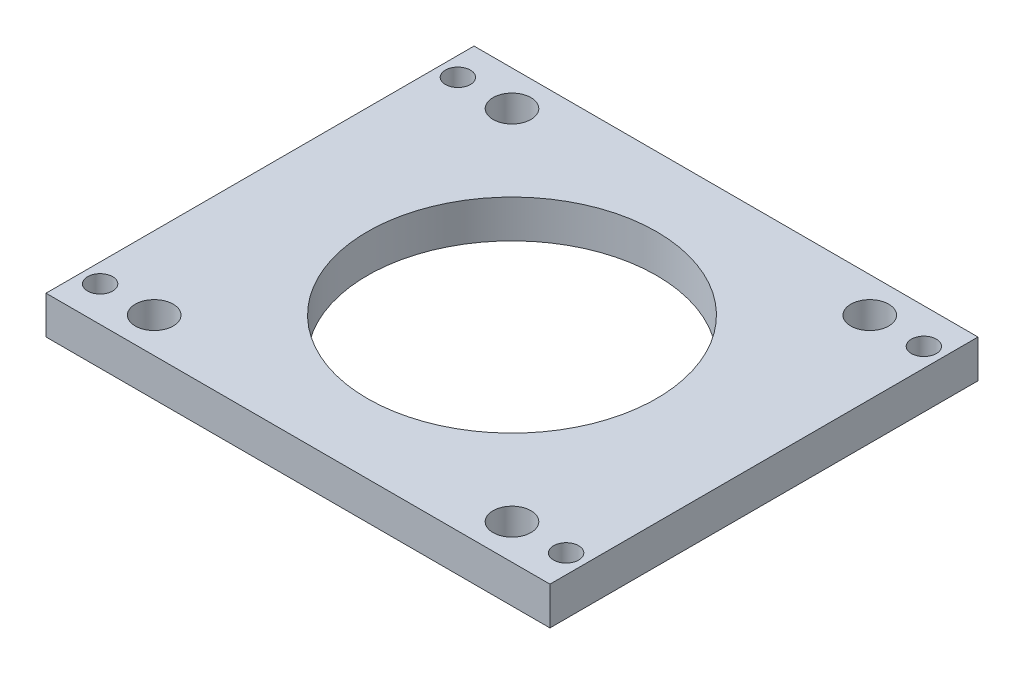
ISO-10303-21;
HEADER;
FILE_DESCRIPTION(('STEP AP214'),'2;1');
FILE_NAME('part.step','',(''),(''),'','','');
FILE_SCHEMA(('AUTOMOTIVE_DESIGN { 1 0 10303 214 1 1 1 1 }'));
ENDSEC;
DATA;
#1=APPLICATION_CONTEXT('core data for automotive mechanical design processes');
#2=APPLICATION_PROTOCOL_DEFINITION('international standard','automotive_design',2000,#1);
#3=PRODUCT_CONTEXT('',#1,'mechanical');
#4=PRODUCT('Part','Part','',(#3));
#5=PRODUCT_RELATED_PRODUCT_CATEGORY('part','',(#4));
#6=PRODUCT_DEFINITION_FORMATION('','',#4);
#7=PRODUCT_DEFINITION_CONTEXT('part definition',#1,'design');
#8=PRODUCT_DEFINITION('design','',#6,#7);
#9=PRODUCT_DEFINITION_SHAPE('','',#8);
#10=(LENGTH_UNIT() NAMED_UNIT(*) SI_UNIT(.MILLI.,.METRE.));
#11=(NAMED_UNIT(*) PLANE_ANGLE_UNIT() SI_UNIT($,.RADIAN.));
#12=(NAMED_UNIT(*) SI_UNIT($,.STERADIAN.) SOLID_ANGLE_UNIT());
#13=UNCERTAINTY_MEASURE_WITH_UNIT(LENGTH_MEASURE(1.E-05),#10,'distance_accuracy_value','');
#14=(GEOMETRIC_REPRESENTATION_CONTEXT(3) GLOBAL_UNCERTAINTY_ASSIGNED_CONTEXT((#13)) GLOBAL_UNIT_ASSIGNED_CONTEXT((#10,
#11,#12)) REPRESENTATION_CONTEXT('',''));
#15=CARTESIAN_POINT('',(0.,0.,0.));
#16=DIRECTION('',(0.,0.,1.));
#17=DIRECTION('',(1.,0.,0.));
#18=AXIS2_PLACEMENT_3D('',#15,#16,#17);
#19=CARTESIAN_POINT('',(0.,5.,0.));
#20=DIRECTION('',(0.,-1.,0.));
#21=DIRECTION('',(0.,0.,-1.));
#22=AXIS2_PLACEMENT_3D('',#19,#20,#21);
#23=PLANE('',#22);
#24=CARTESIAN_POINT('',(63.9,5.,-51.77));
#25=DIRECTION('',(0.,1.,0.));
#26=DIRECTION('',(0.,0.,1.));
#27=AXIS2_PLACEMENT_3D('',#24,#25,#26);
#28=CIRCLE('',#27,1.64999999999998);
#29=CARTESIAN_POINT('',(63.9,5.,-50.12));
#30=VERTEX_POINT('',#29);
#31=EDGE_CURVE('E163',#30,#30,#28,.T.);
#32=ORIENTED_EDGE('',*,*,#31,.F.);
#33=EDGE_LOOP('',(#32));
#34=FACE_BOUND('',#33,.T.);
#35=CARTESIAN_POINT('',(63.8999999999999,5.,-4.63));
#36=DIRECTION('',(0.,1.,0.));
#37=DIRECTION('',(0.,0.,1.));
#38=AXIS2_PLACEMENT_3D('',#35,#36,#37);
#39=CIRCLE('',#38,1.64999999999998);
#40=CARTESIAN_POINT('',(63.8999999999999,5.,-2.98000000000002));
#41=VERTEX_POINT('',#40);
#42=EDGE_CURVE('E157',#41,#41,#39,.T.);
#43=ORIENTED_EDGE('',*,*,#42,.F.);
#44=EDGE_LOOP('',(#43));
#45=FACE_BOUND('',#44,.T.);
#46=CARTESIAN_POINT('',(2.5,5.,-4.63));
#47=DIRECTION('',(0.,1.,0.));
#48=DIRECTION('',(0.,0.,1.));
#49=AXIS2_PLACEMENT_3D('',#46,#47,#48);
#50=CIRCLE('',#49,1.64999999999999);
#51=CARTESIAN_POINT('',(2.5,5.,-2.98000000000001));
#52=VERTEX_POINT('',#51);
#53=EDGE_CURVE('E151',#52,#52,#50,.T.);
#54=ORIENTED_EDGE('',*,*,#53,.F.);
#55=EDGE_LOOP('',(#54));
#56=FACE_BOUND('',#55,.T.);
#57=CARTESIAN_POINT('',(2.5,5.,-51.77));
#58=DIRECTION('',(0.,1.,0.));
#59=DIRECTION('',(0.,0.,1.));
#60=AXIS2_PLACEMENT_3D('',#57,#58,#59);
#61=CIRCLE('',#60,1.64999999999999);
#62=CARTESIAN_POINT('',(2.5,5.,-50.12));
#63=VERTEX_POINT('',#62);
#64=EDGE_CURVE('E145',#63,#63,#61,.T.);
#65=ORIENTED_EDGE('',*,*,#64,.F.);
#66=EDGE_LOOP('',(#65));
#67=FACE_BOUND('',#66,.T.);
#68=CARTESIAN_POINT('',(56.77,5.,-4.63));
#69=DIRECTION('',(0.,1.,0.));
#70=DIRECTION('',(0.,0.,1.));
#71=AXIS2_PLACEMENT_3D('',#68,#69,#70);
#72=CIRCLE('',#71,2.5);
#73=CARTESIAN_POINT('',(56.77,5.,-2.13));
#74=VERTEX_POINT('',#73);
#75=EDGE_CURVE('E128',#74,#74,#72,.T.);
#76=ORIENTED_EDGE('',*,*,#75,.F.);
#77=EDGE_LOOP('',(#76));
#78=FACE_BOUND('',#77,.T.);
#79=CARTESIAN_POINT('',(9.62999999999998,5.,-51.77));
#80=DIRECTION('',(0.,1.,0.));
#81=DIRECTION('',(0.,0.,1.));
#82=AXIS2_PLACEMENT_3D('',#79,#80,#81);
#83=CIRCLE('',#82,2.5);
#84=CARTESIAN_POINT('',(9.62999999999998,5.,-49.27));
#85=VERTEX_POINT('',#84);
#86=EDGE_CURVE('E116',#85,#85,#83,.T.);
#87=ORIENTED_EDGE('',*,*,#86,.F.);
#88=EDGE_LOOP('',(#87));
#89=FACE_BOUND('',#88,.T.);
#90=DIRECTION('',(0.,0.,1.));
#91=VECTOR('',#90,1.);
#92=CARTESIAN_POINT('',(0.,5.,0.));
#93=LINE('',#92,#91);
#94=CARTESIAN_POINT('',(0.,5.,-56.4));
#95=VERTEX_POINT('',#94);
#96=CARTESIAN_POINT('',(0.,5.,0.));
#97=VERTEX_POINT('',#96);
#98=EDGE_CURVE('E86',#95,#97,#93,.T.);
#99=ORIENTED_EDGE('',*,*,#98,.T.);
#100=DIRECTION('',(1.,0.,0.));
#101=VECTOR('',#100,1.);
#102=CARTESIAN_POINT('',(0.,5.,0.));
#103=LINE('',#102,#101);
#104=CARTESIAN_POINT('',(66.4,5.,0.));
#105=VERTEX_POINT('',#104);
#106=EDGE_CURVE('E81',#97,#105,#103,.T.);
#107=ORIENTED_EDGE('',*,*,#106,.T.);
#108=DIRECTION('',(0.,0.,-1.));
#109=VECTOR('',#108,1.);
#110=CARTESIAN_POINT('',(66.4,5.,0.));
#111=LINE('',#110,#109);
#112=CARTESIAN_POINT('',(66.4,5.,-56.4));
#113=VERTEX_POINT('',#112);
#114=EDGE_CURVE('E84',#105,#113,#111,.T.);
#115=ORIENTED_EDGE('',*,*,#114,.T.);
#116=DIRECTION('',(-1.,0.,0.));
#117=VECTOR('',#116,1.);
#118=CARTESIAN_POINT('',(0.,5.,-56.4));
#119=LINE('',#118,#117);
#120=EDGE_CURVE('E51',#113,#95,#119,.T.);
#121=ORIENTED_EDGE('',*,*,#120,.T.);
#122=EDGE_LOOP('',(#99,#107,#115,#121));
#123=FACE_BOUND('',#122,.T.);
#124=CARTESIAN_POINT('',(33.2,5.,-28.2));
#125=DIRECTION('',(0.,1.,0.));
#126=DIRECTION('',(0.,0.,1.));
#127=AXIS2_PLACEMENT_3D('',#124,#125,#126);
#128=CIRCLE('',#127,19.05);
#129=CARTESIAN_POINT('',(33.2,5.,-9.14999999999999));
#130=VERTEX_POINT('',#129);
#131=EDGE_CURVE('E101',#130,#130,#128,.T.);
#132=ORIENTED_EDGE('',*,*,#131,.F.);
#133=EDGE_LOOP('',(#132));
#134=FACE_BOUND('',#133,.T.);
#135=CARTESIAN_POINT('',(56.77,5.,-51.77));
#136=DIRECTION('',(0.,1.,0.));
#137=DIRECTION('',(0.,0.,-1.));
#138=AXIS2_PLACEMENT_3D('',#135,#136,#137);
#139=CIRCLE('',#138,2.5);
#140=CARTESIAN_POINT('',(56.77,5.,-54.27));
#141=VERTEX_POINT('',#140);
#142=EDGE_CURVE('E122',#141,#141,#139,.T.);
#143=ORIENTED_EDGE('',*,*,#142,.F.);
#144=EDGE_LOOP('',(#143));
#145=FACE_BOUND('',#144,.T.);
#146=CARTESIAN_POINT('',(9.62999999999999,5.,-4.63));
#147=DIRECTION('',(0.,1.,0.));
#148=DIRECTION('',(0.,0.,-1.));
#149=AXIS2_PLACEMENT_3D('',#146,#147,#148);
#150=CIRCLE('',#149,2.5);
#151=CARTESIAN_POINT('',(9.62999999999999,5.,-7.13));
#152=VERTEX_POINT('',#151);
#153=EDGE_CURVE('E134',#152,#152,#150,.T.);
#154=ORIENTED_EDGE('',*,*,#153,.F.);
#155=EDGE_LOOP('',(#154));
#156=FACE_BOUND('',#155,.T.);
#157=ADVANCED_FACE('F34',(#34,#45,#56,#67,#78,#89,#123,#134,#145,#156),#23,.F.);
#158=CARTESIAN_POINT('',(0.,0.,0.));
#159=DIRECTION('',(0.,-1.,0.));
#160=DIRECTION('',(0.,0.,-1.));
#161=AXIS2_PLACEMENT_3D('',#158,#159,#160);
#162=PLANE('',#161);
#163=CARTESIAN_POINT('',(63.9,0.,-51.77));
#164=DIRECTION('',(0.,1.,0.));
#165=DIRECTION('',(0.,0.,1.));
#166=AXIS2_PLACEMENT_3D('',#163,#164,#165);
#167=CIRCLE('',#166,1.65);
#168=CARTESIAN_POINT('',(63.9,0.,-50.12));
#169=VERTEX_POINT('',#168);
#170=EDGE_CURVE('E160',#169,#169,#167,.T.);
#171=ORIENTED_EDGE('',*,*,#170,.T.);
#172=EDGE_LOOP('',(#171));
#173=FACE_BOUND('',#172,.T.);
#174=CARTESIAN_POINT('',(63.8999999999999,0.,-4.63));
#175=DIRECTION('',(0.,1.,0.));
#176=DIRECTION('',(0.,0.,1.));
#177=AXIS2_PLACEMENT_3D('',#174,#175,#176);
#178=CIRCLE('',#177,1.65);
#179=CARTESIAN_POINT('',(63.8999999999999,0.,-2.98));
#180=VERTEX_POINT('',#179);
#181=EDGE_CURVE('E154',#180,#180,#178,.T.);
#182=ORIENTED_EDGE('',*,*,#181,.T.);
#183=EDGE_LOOP('',(#182));
#184=FACE_BOUND('',#183,.T.);
#185=CARTESIAN_POINT('',(2.5,0.,-4.63));
#186=DIRECTION('',(0.,1.,0.));
#187=DIRECTION('',(0.,0.,1.));
#188=AXIS2_PLACEMENT_3D('',#185,#186,#187);
#189=CIRCLE('',#188,1.65);
#190=CARTESIAN_POINT('',(2.5,0.,-2.98000000000001));
#191=VERTEX_POINT('',#190);
#192=EDGE_CURVE('E148',#191,#191,#189,.T.);
#193=ORIENTED_EDGE('',*,*,#192,.T.);
#194=EDGE_LOOP('',(#193));
#195=FACE_BOUND('',#194,.T.);
#196=CARTESIAN_POINT('',(2.5,0.,-51.77));
#197=DIRECTION('',(0.,1.,0.));
#198=DIRECTION('',(0.,0.,1.));
#199=AXIS2_PLACEMENT_3D('',#196,#197,#198);
#200=CIRCLE('',#199,1.65);
#201=CARTESIAN_POINT('',(2.5,0.,-50.12));
#202=VERTEX_POINT('',#201);
#203=EDGE_CURVE('E140',#202,#202,#200,.T.);
#204=ORIENTED_EDGE('',*,*,#203,.T.);
#205=EDGE_LOOP('',(#204));
#206=FACE_BOUND('',#205,.T.);
#207=CARTESIAN_POINT('',(56.77,0.,-4.63));
#208=DIRECTION('',(0.,1.,0.));
#209=DIRECTION('',(0.,0.,1.));
#210=AXIS2_PLACEMENT_3D('',#207,#208,#209);
#211=CIRCLE('',#210,2.5);
#212=CARTESIAN_POINT('',(56.77,0.,-2.13));
#213=VERTEX_POINT('',#212);
#214=EDGE_CURVE('E131',#213,#213,#211,.T.);
#215=ORIENTED_EDGE('',*,*,#214,.T.);
#216=EDGE_LOOP('',(#215));
#217=FACE_BOUND('',#216,.T.);
#218=CARTESIAN_POINT('',(9.62999999999998,0.,-51.77));
#219=DIRECTION('',(0.,1.,0.));
#220=DIRECTION('',(0.,0.,1.));
#221=AXIS2_PLACEMENT_3D('',#218,#219,#220);
#222=CIRCLE('',#221,2.5);
#223=CARTESIAN_POINT('',(9.62999999999998,0.,-49.27));
#224=VERTEX_POINT('',#223);
#225=EDGE_CURVE('E119',#224,#224,#222,.T.);
#226=ORIENTED_EDGE('',*,*,#225,.T.);
#227=EDGE_LOOP('',(#226));
#228=FACE_BOUND('',#227,.T.);
#229=DIRECTION('',(0.,0.,1.));
#230=VECTOR('',#229,1.);
#231=CARTESIAN_POINT('',(0.,0.,0.));
#232=LINE('',#231,#230);
#233=CARTESIAN_POINT('',(0.,0.,-56.4));
#234=VERTEX_POINT('',#233);
#235=CARTESIAN_POINT('',(0.,0.,0.));
#236=VERTEX_POINT('',#235);
#237=EDGE_CURVE('E98',#234,#236,#232,.T.);
#238=ORIENTED_EDGE('',*,*,#237,.F.);
#239=DIRECTION('',(-1.,0.,0.));
#240=VECTOR('',#239,1.);
#241=CARTESIAN_POINT('',(0.,0.,-56.4));
#242=LINE('',#241,#240);
#243=CARTESIAN_POINT('',(66.4,0.,-56.4));
#244=VERTEX_POINT('',#243);
#245=EDGE_CURVE('E74',#244,#234,#242,.T.);
#246=ORIENTED_EDGE('',*,*,#245,.F.);
#247=DIRECTION('',(0.,0.,-1.));
#248=VECTOR('',#247,1.);
#249=CARTESIAN_POINT('',(66.4,0.,0.));
#250=LINE('',#249,#248);
#251=CARTESIAN_POINT('',(66.4,0.,0.));
#252=VERTEX_POINT('',#251);
#253=EDGE_CURVE('E68',#252,#244,#250,.T.);
#254=ORIENTED_EDGE('',*,*,#253,.F.);
#255=DIRECTION('',(1.,0.,0.));
#256=VECTOR('',#255,1.);
#257=CARTESIAN_POINT('',(0.,0.,0.));
#258=LINE('',#257,#256);
#259=EDGE_CURVE('E90',#236,#252,#258,.T.);
#260=ORIENTED_EDGE('',*,*,#259,.F.);
#261=EDGE_LOOP('',(#238,#246,#254,#260));
#262=FACE_BOUND('',#261,.T.);
#263=CARTESIAN_POINT('',(33.2,0.,-28.2));
#264=DIRECTION('',(0.,1.,0.));
#265=DIRECTION('',(0.,0.,1.));
#266=AXIS2_PLACEMENT_3D('',#263,#264,#265);
#267=CIRCLE('',#266,19.05);
#268=CARTESIAN_POINT('',(33.2,0.,-9.14999999999999));
#269=VERTEX_POINT('',#268);
#270=EDGE_CURVE('E113',#269,#269,#267,.T.);
#271=ORIENTED_EDGE('',*,*,#270,.T.);
#272=EDGE_LOOP('',(#271));
#273=FACE_BOUND('',#272,.T.);
#274=CARTESIAN_POINT('',(56.77,0.,-51.77));
#275=DIRECTION('',(0.,1.,0.));
#276=DIRECTION('',(0.,0.,-1.));
#277=AXIS2_PLACEMENT_3D('',#274,#275,#276);
#278=CIRCLE('',#277,2.5);
#279=CARTESIAN_POINT('',(56.77,0.,-54.27));
#280=VERTEX_POINT('',#279);
#281=EDGE_CURVE('E125',#280,#280,#278,.T.);
#282=ORIENTED_EDGE('',*,*,#281,.T.);
#283=EDGE_LOOP('',(#282));
#284=FACE_BOUND('',#283,.T.);
#285=CARTESIAN_POINT('',(9.62999999999999,0.,-4.63));
#286=DIRECTION('',(0.,1.,0.));
#287=DIRECTION('',(0.,0.,-1.));
#288=AXIS2_PLACEMENT_3D('',#285,#286,#287);
#289=CIRCLE('',#288,2.5);
#290=CARTESIAN_POINT('',(9.62999999999999,0.,-7.13));
#291=VERTEX_POINT('',#290);
#292=EDGE_CURVE('E137',#291,#291,#289,.T.);
#293=ORIENTED_EDGE('',*,*,#292,.T.);
#294=EDGE_LOOP('',(#293));
#295=FACE_BOUND('',#294,.T.);
#296=ADVANCED_FACE('F109',(#173,#184,#195,#206,#217,#228,#262,#273,#284,#295),#162,.T.);
#297=CARTESIAN_POINT('',(0.,5.,0.));
#298=DIRECTION('',(1.,0.,0.));
#299=DIRECTION('',(0.,0.,-1.));
#300=AXIS2_PLACEMENT_3D('',#297,#298,#299);
#301=PLANE('',#300);
#302=ORIENTED_EDGE('',*,*,#237,.T.);
#303=DIRECTION('',(0.,-1.,0.));
#304=VECTOR('',#303,1.);
#305=CARTESIAN_POINT('',(0.,5.,0.));
#306=LINE('',#305,#304);
#307=EDGE_CURVE('E11',#97,#236,#306,.T.);
#308=ORIENTED_EDGE('',*,*,#307,.F.);
#309=ORIENTED_EDGE('',*,*,#98,.F.);
#310=DIRECTION('',(0.,-1.,0.));
#311=VECTOR('',#310,1.);
#312=CARTESIAN_POINT('',(0.,5.,-56.4));
#313=LINE('',#312,#311);
#314=EDGE_CURVE('E94',#95,#234,#313,.T.);
#315=ORIENTED_EDGE('',*,*,#314,.T.);
#316=EDGE_LOOP('',(#302,#308,#309,#315));
#317=FACE_BOUND('',#316,.T.);
#318=ADVANCED_FACE('F36',(#317),#301,.F.);
#319=CARTESIAN_POINT('',(0.,5.,0.));
#320=DIRECTION('',(0.,0.,-1.));
#321=DIRECTION('',(-1.,0.,0.));
#322=AXIS2_PLACEMENT_3D('',#319,#320,#321);
#323=PLANE('',#322);
#324=ORIENTED_EDGE('',*,*,#259,.T.);
#325=DIRECTION('',(0.,-1.,0.));
#326=VECTOR('',#325,1.);
#327=CARTESIAN_POINT('',(66.4,5.,0.));
#328=LINE('',#327,#326);
#329=EDGE_CURVE('E43',#105,#252,#328,.T.);
#330=ORIENTED_EDGE('',*,*,#329,.F.);
#331=ORIENTED_EDGE('',*,*,#106,.F.);
#332=ORIENTED_EDGE('',*,*,#307,.T.);
#333=EDGE_LOOP('',(#324,#330,#331,#332));
#334=FACE_BOUND('',#333,.T.);
#335=ADVANCED_FACE('F89',(#334),#323,.F.);
#336=CARTESIAN_POINT('',(66.4,5.,0.));
#337=DIRECTION('',(-1.,0.,0.));
#338=DIRECTION('',(0.,0.,1.));
#339=AXIS2_PLACEMENT_3D('',#336,#337,#338);
#340=PLANE('',#339);
#341=ORIENTED_EDGE('',*,*,#253,.T.);
#342=DIRECTION('',(0.,-1.,0.));
#343=VECTOR('',#342,1.);
#344=CARTESIAN_POINT('',(66.4,5.,-56.4));
#345=LINE('',#344,#343);
#346=EDGE_CURVE('E91',#113,#244,#345,.T.);
#347=ORIENTED_EDGE('',*,*,#346,.F.);
#348=ORIENTED_EDGE('',*,*,#114,.F.);
#349=ORIENTED_EDGE('',*,*,#329,.T.);
#350=EDGE_LOOP('',(#341,#347,#348,#349));
#351=FACE_BOUND('',#350,.T.);
#352=ADVANCED_FACE('F92',(#351),#340,.F.);
#353=CARTESIAN_POINT('',(0.,5.,-56.4));
#354=DIRECTION('',(0.,0.,1.));
#355=DIRECTION('',(1.,0.,0.));
#356=AXIS2_PLACEMENT_3D('',#353,#354,#355);
#357=PLANE('',#356);
#358=ORIENTED_EDGE('',*,*,#245,.T.);
#359=ORIENTED_EDGE('',*,*,#314,.F.);
#360=ORIENTED_EDGE('',*,*,#120,.F.);
#361=ORIENTED_EDGE('',*,*,#346,.T.);
#362=EDGE_LOOP('',(#358,#359,#360,#361));
#363=FACE_BOUND('',#362,.T.);
#364=ADVANCED_FACE('F106',(#363),#357,.F.);
#365=CARTESIAN_POINT('',(33.2,5.,-28.2));
#366=DIRECTION('',(0.,-1.,0.));
#367=DIRECTION('',(0.,0.,-1.));
#368=AXIS2_PLACEMENT_3D('',#365,#366,#367);
#369=CYLINDRICAL_SURFACE('',#368,19.05);
#370=ORIENTED_EDGE('',*,*,#131,.T.);
#371=EDGE_LOOP('',(#370));
#372=FACE_BOUND('',#371,.T.);
#373=ORIENTED_EDGE('',*,*,#270,.F.);
#374=EDGE_LOOP('',(#373));
#375=FACE_BOUND('',#374,.T.);
#376=ADVANCED_FACE('F186',(#372,#375),#369,.F.);
#377=CARTESIAN_POINT('',(9.62999999999998,5.,-51.77));
#378=DIRECTION('',(0.,-1.,0.));
#379=DIRECTION('',(0.,0.,-1.));
#380=AXIS2_PLACEMENT_3D('',#377,#378,#379);
#381=CYLINDRICAL_SURFACE('',#380,2.5);
#382=ORIENTED_EDGE('',*,*,#86,.T.);
#383=EDGE_LOOP('',(#382));
#384=FACE_BOUND('',#383,.T.);
#385=ORIENTED_EDGE('',*,*,#225,.F.);
#386=EDGE_LOOP('',(#385));
#387=FACE_BOUND('',#386,.T.);
#388=ADVANCED_FACE('F182',(#384,#387),#381,.F.);
#389=CARTESIAN_POINT('',(56.77,5.,-51.77));
#390=DIRECTION('',(0.,-1.,0.));
#391=DIRECTION('',(0.,0.,-1.));
#392=AXIS2_PLACEMENT_3D('',#389,#390,#391);
#393=CYLINDRICAL_SURFACE('',#392,2.5);
#394=ORIENTED_EDGE('',*,*,#142,.T.);
#395=EDGE_LOOP('',(#394));
#396=FACE_BOUND('',#395,.T.);
#397=ORIENTED_EDGE('',*,*,#281,.F.);
#398=EDGE_LOOP('',(#397));
#399=FACE_BOUND('',#398,.T.);
#400=ADVANCED_FACE('F185',(#396,#399),#393,.F.);
#401=CARTESIAN_POINT('',(56.77,5.,-4.63));
#402=DIRECTION('',(0.,-1.,0.));
#403=DIRECTION('',(0.,0.,-1.));
#404=AXIS2_PLACEMENT_3D('',#401,#402,#403);
#405=CYLINDRICAL_SURFACE('',#404,2.5);
#406=ORIENTED_EDGE('',*,*,#75,.T.);
#407=EDGE_LOOP('',(#406));
#408=FACE_BOUND('',#407,.T.);
#409=ORIENTED_EDGE('',*,*,#214,.F.);
#410=EDGE_LOOP('',(#409));
#411=FACE_BOUND('',#410,.T.);
#412=ADVANCED_FACE('F231',(#408,#411),#405,.F.);
#413=CARTESIAN_POINT('',(9.62999999999999,5.,-4.63));
#414=DIRECTION('',(0.,-1.,0.));
#415=DIRECTION('',(0.,0.,-1.));
#416=AXIS2_PLACEMENT_3D('',#413,#414,#415);
#417=CYLINDRICAL_SURFACE('',#416,2.5);
#418=ORIENTED_EDGE('',*,*,#153,.T.);
#419=EDGE_LOOP('',(#418));
#420=FACE_BOUND('',#419,.T.);
#421=ORIENTED_EDGE('',*,*,#292,.F.);
#422=EDGE_LOOP('',(#421));
#423=FACE_BOUND('',#422,.T.);
#424=ADVANCED_FACE('F239',(#420,#423),#417,.F.);
#425=CARTESIAN_POINT('',(2.5,5.,-51.77));
#426=DIRECTION('',(0.,1.,0.));
#427=DIRECTION('',(0.,0.,1.));
#428=AXIS2_PLACEMENT_3D('',#425,#426,#427);
#429=CYLINDRICAL_SURFACE('',#428,1.64999999999999);
#430=ORIENTED_EDGE('',*,*,#203,.F.);
#431=EDGE_LOOP('',(#430));
#432=FACE_BOUND('',#431,.T.);
#433=ORIENTED_EDGE('',*,*,#64,.T.);
#434=EDGE_LOOP('',(#433));
#435=FACE_BOUND('',#434,.T.);
#436=ADVANCED_FACE('F247',(#432,#435),#429,.F.);
#437=CARTESIAN_POINT('',(2.5,5.,-4.63));
#438=DIRECTION('',(0.,1.,0.));
#439=DIRECTION('',(0.,0.,1.));
#440=AXIS2_PLACEMENT_3D('',#437,#438,#439);
#441=CYLINDRICAL_SURFACE('',#440,1.64999999999999);
#442=ORIENTED_EDGE('',*,*,#192,.F.);
#443=EDGE_LOOP('',(#442));
#444=FACE_BOUND('',#443,.T.);
#445=ORIENTED_EDGE('',*,*,#53,.T.);
#446=EDGE_LOOP('',(#445));
#447=FACE_BOUND('',#446,.T.);
#448=ADVANCED_FACE('F256',(#444,#447),#441,.F.);
#449=CARTESIAN_POINT('',(63.8999999999999,5.,-4.63));
#450=DIRECTION('',(0.,1.,0.));
#451=DIRECTION('',(0.,0.,1.));
#452=AXIS2_PLACEMENT_3D('',#449,#450,#451);
#453=CYLINDRICAL_SURFACE('',#452,1.64999999999999);
#454=ORIENTED_EDGE('',*,*,#181,.F.);
#455=EDGE_LOOP('',(#454));
#456=FACE_BOUND('',#455,.T.);
#457=ORIENTED_EDGE('',*,*,#42,.T.);
#458=EDGE_LOOP('',(#457));
#459=FACE_BOUND('',#458,.T.);
#460=ADVANCED_FACE('F263',(#456,#459),#453,.F.);
#461=CARTESIAN_POINT('',(63.9,5.,-51.77));
#462=DIRECTION('',(0.,1.,0.));
#463=DIRECTION('',(0.,0.,1.));
#464=AXIS2_PLACEMENT_3D('',#461,#462,#463);
#465=CYLINDRICAL_SURFACE('',#464,1.64999999999999);
#466=ORIENTED_EDGE('',*,*,#170,.F.);
#467=EDGE_LOOP('',(#466));
#468=FACE_BOUND('',#467,.T.);
#469=ORIENTED_EDGE('',*,*,#31,.T.);
#470=EDGE_LOOP('',(#469));
#471=FACE_BOUND('',#470,.T.);
#472=ADVANCED_FACE('F167',(#468,#471),#465,.F.);
#473=CLOSED_SHELL('',(#157,#296,#318,#335,#352,#364,#376,#388,#400,#412,#424,#436,#448,#460,#472));
#474=MANIFOLD_SOLID_BREP('B2',#473);
#475=ADVANCED_BREP_SHAPE_REPRESENTATION('',(#18,#474),#14);
#476=SHAPE_DEFINITION_REPRESENTATION(#9,#475);
ENDSEC;
END-ISO-10303-21;
